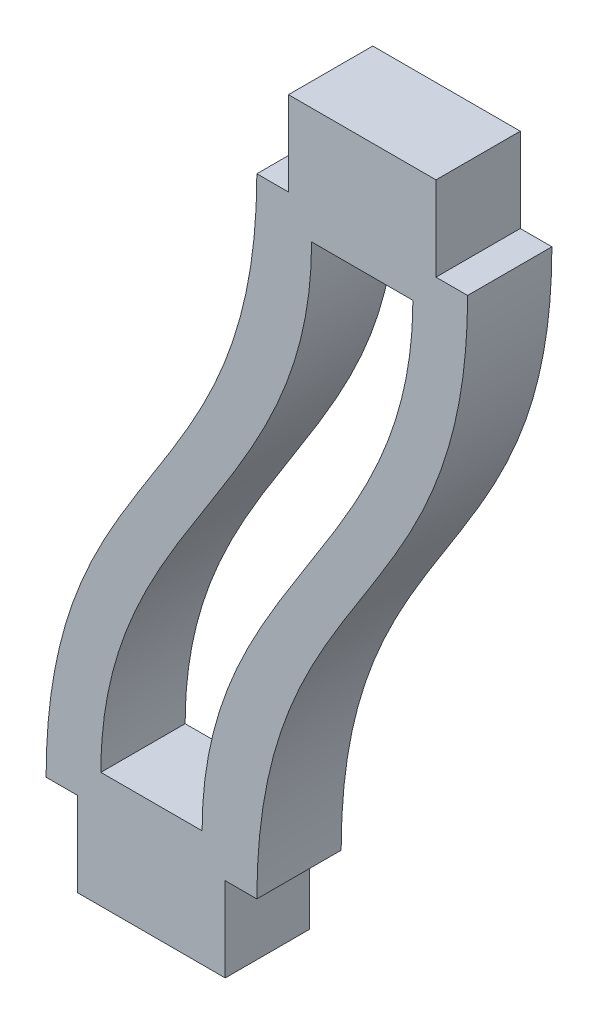
ISO-10303-21;
HEADER;
FILE_DESCRIPTION(('STEP AP214'),'2;1');
FILE_NAME('part.step','',(''),(''),'','','');
FILE_SCHEMA(('AUTOMOTIVE_DESIGN { 1 0 10303 214 1 1 1 1 }'));
ENDSEC;
DATA;
#1=APPLICATION_CONTEXT('core data for automotive mechanical design processes');
#2=APPLICATION_PROTOCOL_DEFINITION('international standard','automotive_design',2000,#1);
#3=PRODUCT_CONTEXT('',#1,'mechanical');
#4=PRODUCT('Part','Part','',(#3));
#5=PRODUCT_RELATED_PRODUCT_CATEGORY('part','',(#4));
#6=PRODUCT_DEFINITION_FORMATION('','',#4);
#7=PRODUCT_DEFINITION_CONTEXT('part definition',#1,'design');
#8=PRODUCT_DEFINITION('design','',#6,#7);
#9=PRODUCT_DEFINITION_SHAPE('','',#8);
#10=(LENGTH_UNIT() NAMED_UNIT(*) SI_UNIT(.MILLI.,.METRE.));
#11=(NAMED_UNIT(*) PLANE_ANGLE_UNIT() SI_UNIT($,.RADIAN.));
#12=(NAMED_UNIT(*) SI_UNIT($,.STERADIAN.) SOLID_ANGLE_UNIT());
#13=UNCERTAINTY_MEASURE_WITH_UNIT(LENGTH_MEASURE(1.E-05),#10,'distance_accuracy_value','');
#14=(GEOMETRIC_REPRESENTATION_CONTEXT(3) GLOBAL_UNCERTAINTY_ASSIGNED_CONTEXT((#13)) GLOBAL_UNIT_ASSIGNED_CONTEXT((#10,
#11,#12)) REPRESENTATION_CONTEXT('',''));
#15=CARTESIAN_POINT('',(0.,0.,0.));
#16=DIRECTION('',(0.,0.,1.));
#17=DIRECTION('',(1.,0.,0.));
#18=AXIS2_PLACEMENT_3D('',#15,#16,#17);
#19=CARTESIAN_POINT('',(0.,0.,4.));
#20=DIRECTION('',(1.,0.,0.));
#21=DIRECTION('',(0.,0.,-1.));
#22=AXIS2_PLACEMENT_3D('',#19,#20,#21);
#23=PLANE('',#22);
#24=DIRECTION('',(0.,-1.,0.));
#25=VECTOR('',#24,1.);
#26=CARTESIAN_POINT('',(0.,0.,0.));
#27=LINE('',#26,#25);
#28=CARTESIAN_POINT('',(0.,4.,0.));
#29=VERTEX_POINT('',#28);
#30=CARTESIAN_POINT('',(0.,0.,0.));
#31=VERTEX_POINT('',#30);
#32=EDGE_CURVE('E162',#29,#31,#27,.T.);
#33=ORIENTED_EDGE('',*,*,#32,.T.);
#34=DIRECTION('',(0.,0.,-1.));
#35=VECTOR('',#34,1.);
#36=CARTESIAN_POINT('',(0.,0.,4.));
#37=LINE('',#36,#35);
#38=CARTESIAN_POINT('',(0.,0.,4.));
#39=VERTEX_POINT('',#38);
#40=EDGE_CURVE('E11',#39,#31,#37,.T.);
#41=ORIENTED_EDGE('',*,*,#40,.F.);
#42=DIRECTION('',(0.,-1.,0.));
#43=VECTOR('',#42,1.);
#44=CARTESIAN_POINT('',(0.,0.,4.));
#45=LINE('',#44,#43);
#46=CARTESIAN_POINT('',(0.,4.,4.));
#47=VERTEX_POINT('',#46);
#48=EDGE_CURVE('E261',#47,#39,#45,.T.);
#49=ORIENTED_EDGE('',*,*,#48,.F.);
#50=DIRECTION('',(0.,0.,-1.));
#51=VECTOR('',#50,1.);
#52=CARTESIAN_POINT('',(0.,4.,4.));
#53=LINE('',#52,#51);
#54=EDGE_CURVE('E226',#47,#29,#53,.T.);
#55=ORIENTED_EDGE('',*,*,#54,.T.);
#56=EDGE_LOOP('',(#33,#41,#49,#55));
#57=FACE_BOUND('',#56,.T.);
#58=ADVANCED_FACE('F36',(#57),#23,.F.);
#59=CARTESIAN_POINT('',(0.,0.,4.));
#60=DIRECTION('',(0.,1.,0.));
#61=DIRECTION('',(0.,0.,1.));
#62=AXIS2_PLACEMENT_3D('',#59,#60,#61);
#63=PLANE('',#62);
#64=DIRECTION('',(1.,0.,0.));
#65=VECTOR('',#64,1.);
#66=CARTESIAN_POINT('',(0.,0.,0.));
#67=LINE('',#66,#65);
#68=CARTESIAN_POINT('',(7.,0.,0.));
#69=VERTEX_POINT('',#68);
#70=EDGE_CURVE('E229',#31,#69,#67,.T.);
#71=ORIENTED_EDGE('',*,*,#70,.T.);
#72=DIRECTION('',(0.,0.,-1.));
#73=VECTOR('',#72,1.);
#74=CARTESIAN_POINT('',(7.,0.,4.));
#75=LINE('',#74,#73);
#76=CARTESIAN_POINT('',(7.,0.,4.));
#77=VERTEX_POINT('',#76);
#78=EDGE_CURVE('E43',#77,#69,#75,.T.);
#79=ORIENTED_EDGE('',*,*,#78,.F.);
#80=DIRECTION('',(1.,0.,0.));
#81=VECTOR('',#80,1.);
#82=CARTESIAN_POINT('',(0.,0.,4.));
#83=LINE('',#82,#81);
#84=EDGE_CURVE('E344',#39,#77,#83,.T.);
#85=ORIENTED_EDGE('',*,*,#84,.F.);
#86=ORIENTED_EDGE('',*,*,#40,.T.);
#87=EDGE_LOOP('',(#71,#79,#85,#86));
#88=FACE_BOUND('',#87,.T.);
#89=ADVANCED_FACE('F337',(#88),#63,.F.);
#90=CARTESIAN_POINT('',(7.,0.,4.));
#91=DIRECTION('',(-1.,0.,0.));
#92=DIRECTION('',(0.,0.,1.));
#93=AXIS2_PLACEMENT_3D('',#90,#91,#92);
#94=PLANE('',#93);
#95=DIRECTION('',(0.,1.,0.));
#96=VECTOR('',#95,1.);
#97=CARTESIAN_POINT('',(7.,0.,0.));
#98=LINE('',#97,#96);
#99=CARTESIAN_POINT('',(7.,4.,0.));
#100=VERTEX_POINT('',#99);
#101=EDGE_CURVE('E231',#69,#100,#98,.T.);
#102=ORIENTED_EDGE('',*,*,#101,.T.);
#103=DIRECTION('',(0.,0.,-1.));
#104=VECTOR('',#103,1.);
#105=CARTESIAN_POINT('',(7.,4.,4.));
#106=LINE('',#105,#104);
#107=CARTESIAN_POINT('',(7.,4.,4.));
#108=VERTEX_POINT('',#107);
#109=EDGE_CURVE('E288',#108,#100,#106,.T.);
#110=ORIENTED_EDGE('',*,*,#109,.F.);
#111=DIRECTION('',(0.,1.,0.));
#112=VECTOR('',#111,1.);
#113=CARTESIAN_POINT('',(7.,0.,4.));
#114=LINE('',#113,#112);
#115=EDGE_CURVE('E297',#77,#108,#114,.T.);
#116=ORIENTED_EDGE('',*,*,#115,.F.);
#117=ORIENTED_EDGE('',*,*,#78,.T.);
#118=EDGE_LOOP('',(#102,#110,#116,#117));
#119=FACE_BOUND('',#118,.T.);
#120=ADVANCED_FACE('F295',(#119),#94,.F.);
#121=CARTESIAN_POINT('',(7.,4.,4.));
#122=DIRECTION('',(0.,1.,0.));
#123=DIRECTION('',(0.,0.,1.));
#124=AXIS2_PLACEMENT_3D('',#121,#122,#123);
#125=PLANE('',#124);
#126=DIRECTION('',(1.,0.,0.));
#127=VECTOR('',#126,1.);
#128=CARTESIAN_POINT('',(7.,4.,0.));
#129=LINE('',#128,#127);
#130=CARTESIAN_POINT('',(8.5,4.,0.));
#131=VERTEX_POINT('',#130);
#132=EDGE_CURVE('E233',#100,#131,#129,.T.);
#133=ORIENTED_EDGE('',*,*,#132,.T.);
#134=DIRECTION('',(0.,0.,-1.));
#135=VECTOR('',#134,1.);
#136=CARTESIAN_POINT('',(8.5,4.,4.));
#137=LINE('',#136,#135);
#138=CARTESIAN_POINT('',(8.5,4.,4.));
#139=VERTEX_POINT('',#138);
#140=EDGE_CURVE('E285',#139,#131,#137,.T.);
#141=ORIENTED_EDGE('',*,*,#140,.F.);
#142=DIRECTION('',(1.,0.,0.));
#143=VECTOR('',#142,1.);
#144=CARTESIAN_POINT('',(7.,4.,4.));
#145=LINE('',#144,#143);
#146=EDGE_CURVE('E315',#108,#139,#145,.T.);
#147=ORIENTED_EDGE('',*,*,#146,.F.);
#148=ORIENTED_EDGE('',*,*,#109,.T.);
#149=EDGE_LOOP('',(#133,#141,#147,#148));
#150=FACE_BOUND('',#149,.T.);
#151=ADVANCED_FACE('F305',(#150),#125,.F.);
#152=CARTESIAN_POINT('',(8.5,4.,4.));
#153=CARTESIAN_POINT('',(8.5,18.0183650964577,4.));
#154=CARTESIAN_POINT('',(18.5,19.7816349035423,4.));
#155=CARTESIAN_POINT('',(18.5,33.8,4.));
#156=B_SPLINE_CURVE_WITH_KNOTS('',3,(#152,#153,#154,#155),.UNSPECIFIED.,.F.,.F.,(4,4),(0.,1.),.UNSPECIFIED.);
#157=DIRECTION('',(0.,0.,-1.));
#158=VECTOR('',#157,1.);
#159=SURFACE_OF_LINEAR_EXTRUSION('',#156,#158);
#160=CARTESIAN_POINT('',(8.5,4.,0.));
#161=CARTESIAN_POINT('',(8.5,18.0183650964577,0.));
#162=CARTESIAN_POINT('',(18.5,19.7816349035423,0.));
#163=CARTESIAN_POINT('',(18.5,33.8,0.));
#164=B_SPLINE_CURVE_WITH_KNOTS('',3,(#160,#161,#162,#163),.UNSPECIFIED.,.F.,.F.,(4,4),(0.,1.),.UNSPECIFIED.);
#165=CARTESIAN_POINT('',(18.5,33.8,0.));
#166=VERTEX_POINT('',#165);
#167=EDGE_CURVE('E235',#131,#166,#164,.T.);
#168=ORIENTED_EDGE('',*,*,#167,.T.);
#169=DIRECTION('',(0.,0.,-1.));
#170=VECTOR('',#169,1.);
#171=CARTESIAN_POINT('',(18.5,33.8,4.));
#172=LINE('',#171,#170);
#173=CARTESIAN_POINT('',(18.5,33.8,4.));
#174=VERTEX_POINT('',#173);
#175=EDGE_CURVE('E282',#174,#166,#172,.T.);
#176=ORIENTED_EDGE('',*,*,#175,.F.);
#177=EDGE_CURVE('E311',#139,#174,#156,.T.);
#178=ORIENTED_EDGE('',*,*,#177,.F.);
#179=ORIENTED_EDGE('',*,*,#140,.T.);
#180=EDGE_LOOP('',(#168,#176,#178,#179));
#181=FACE_BOUND('',#180,.T.);
#182=ADVANCED_FACE('F309',(#181),#159,.F.);
#183=CARTESIAN_POINT('',(17.,33.8,4.));
#184=DIRECTION('',(0.,-1.,0.));
#185=DIRECTION('',(0.,0.,-1.));
#186=AXIS2_PLACEMENT_3D('',#183,#184,#185);
#187=PLANE('',#186);
#188=DIRECTION('',(-1.,0.,0.));
#189=VECTOR('',#188,1.);
#190=CARTESIAN_POINT('',(17.,33.8,0.));
#191=LINE('',#190,#189);
#192=CARTESIAN_POINT('',(17.,33.8,0.));
#193=VERTEX_POINT('',#192);
#194=EDGE_CURVE('E239',#166,#193,#191,.T.);
#195=ORIENTED_EDGE('',*,*,#194,.T.);
#196=DIRECTION('',(0.,0.,-1.));
#197=VECTOR('',#196,1.);
#198=CARTESIAN_POINT('',(17.,33.8,4.));
#199=LINE('',#198,#197);
#200=CARTESIAN_POINT('',(17.,33.8,4.));
#201=VERTEX_POINT('',#200);
#202=EDGE_CURVE('E279',#201,#193,#199,.T.);
#203=ORIENTED_EDGE('',*,*,#202,.F.);
#204=DIRECTION('',(-1.,0.,0.));
#205=VECTOR('',#204,1.);
#206=CARTESIAN_POINT('',(17.,33.8,4.));
#207=LINE('',#206,#205);
#208=EDGE_CURVE('E314',#174,#201,#207,.T.);
#209=ORIENTED_EDGE('',*,*,#208,.F.);
#210=ORIENTED_EDGE('',*,*,#175,.T.);
#211=EDGE_LOOP('',(#195,#203,#209,#210));
#212=FACE_BOUND('',#211,.T.);
#213=ADVANCED_FACE('F332',(#212),#187,.F.);
#214=CARTESIAN_POINT('',(17.,37.8,4.));
#215=DIRECTION('',(-1.,0.,0.));
#216=DIRECTION('',(0.,0.,1.));
#217=AXIS2_PLACEMENT_3D('',#214,#215,#216);
#218=PLANE('',#217);
#219=DIRECTION('',(0.,1.,0.));
#220=VECTOR('',#219,1.);
#221=CARTESIAN_POINT('',(17.,37.8,0.));
#222=LINE('',#221,#220);
#223=CARTESIAN_POINT('',(17.,37.8,0.));
#224=VERTEX_POINT('',#223);
#225=EDGE_CURVE('E244',#193,#224,#222,.T.);
#226=ORIENTED_EDGE('',*,*,#225,.T.);
#227=DIRECTION('',(0.,0.,-1.));
#228=VECTOR('',#227,1.);
#229=CARTESIAN_POINT('',(17.,37.8,4.));
#230=LINE('',#229,#228);
#231=CARTESIAN_POINT('',(17.,37.8,4.));
#232=VERTEX_POINT('',#231);
#233=EDGE_CURVE('E276',#232,#224,#230,.T.);
#234=ORIENTED_EDGE('',*,*,#233,.F.);
#235=DIRECTION('',(0.,1.,0.));
#236=VECTOR('',#235,1.);
#237=CARTESIAN_POINT('',(17.,37.8,4.));
#238=LINE('',#237,#236);
#239=EDGE_CURVE('E317',#201,#232,#238,.T.);
#240=ORIENTED_EDGE('',*,*,#239,.F.);
#241=ORIENTED_EDGE('',*,*,#202,.T.);
#242=EDGE_LOOP('',(#226,#234,#240,#241));
#243=FACE_BOUND('',#242,.T.);
#244=ADVANCED_FACE('F373',(#243),#218,.F.);
#245=CARTESIAN_POINT('',(10.,37.8,4.));
#246=DIRECTION('',(0.,-1.,0.));
#247=DIRECTION('',(0.,0.,-1.));
#248=AXIS2_PLACEMENT_3D('',#245,#246,#247);
#249=PLANE('',#248);
#250=DIRECTION('',(-1.,0.,0.));
#251=VECTOR('',#250,1.);
#252=CARTESIAN_POINT('',(10.,37.8,0.));
#253=LINE('',#252,#251);
#254=CARTESIAN_POINT('',(10.,37.8,0.));
#255=VERTEX_POINT('',#254);
#256=EDGE_CURVE('E246',#224,#255,#253,.T.);
#257=ORIENTED_EDGE('',*,*,#256,.T.);
#258=DIRECTION('',(0.,0.,-1.));
#259=VECTOR('',#258,1.);
#260=CARTESIAN_POINT('',(10.,37.8,4.));
#261=LINE('',#260,#259);
#262=CARTESIAN_POINT('',(10.,37.8,4.));
#263=VERTEX_POINT('',#262);
#264=EDGE_CURVE('E273',#263,#255,#261,.T.);
#265=ORIENTED_EDGE('',*,*,#264,.F.);
#266=DIRECTION('',(-1.,0.,0.));
#267=VECTOR('',#266,1.);
#268=CARTESIAN_POINT('',(10.,37.8,4.));
#269=LINE('',#268,#267);
#270=EDGE_CURVE('E369',#232,#263,#269,.T.);
#271=ORIENTED_EDGE('',*,*,#270,.F.);
#272=ORIENTED_EDGE('',*,*,#233,.T.);
#273=EDGE_LOOP('',(#257,#265,#271,#272));
#274=FACE_BOUND('',#273,.T.);
#275=ADVANCED_FACE('F368',(#274),#249,.F.);
#276=CARTESIAN_POINT('',(10.,33.8,4.));
#277=DIRECTION('',(1.,0.,0.));
#278=DIRECTION('',(0.,0.,-1.));
#279=AXIS2_PLACEMENT_3D('',#276,#277,#278);
#280=PLANE('',#279);
#281=DIRECTION('',(0.,-1.,0.));
#282=VECTOR('',#281,1.);
#283=CARTESIAN_POINT('',(10.,33.8,0.));
#284=LINE('',#283,#282);
#285=CARTESIAN_POINT('',(10.,33.8,0.));
#286=VERTEX_POINT('',#285);
#287=EDGE_CURVE('E248',#255,#286,#284,.T.);
#288=ORIENTED_EDGE('',*,*,#287,.T.);
#289=DIRECTION('',(0.,0.,-1.));
#290=VECTOR('',#289,1.);
#291=CARTESIAN_POINT('',(10.,33.8,4.));
#292=LINE('',#291,#290);
#293=CARTESIAN_POINT('',(10.,33.8,4.));
#294=VERTEX_POINT('',#293);
#295=EDGE_CURVE('E270',#294,#286,#292,.T.);
#296=ORIENTED_EDGE('',*,*,#295,.F.);
#297=DIRECTION('',(0.,-1.,0.));
#298=VECTOR('',#297,1.);
#299=CARTESIAN_POINT('',(10.,33.8,4.));
#300=LINE('',#299,#298);
#301=EDGE_CURVE('E365',#263,#294,#300,.T.);
#302=ORIENTED_EDGE('',*,*,#301,.F.);
#303=ORIENTED_EDGE('',*,*,#264,.T.);
#304=EDGE_LOOP('',(#288,#296,#302,#303));
#305=FACE_BOUND('',#304,.T.);
#306=ADVANCED_FACE('F362',(#305),#280,.F.);
#307=CARTESIAN_POINT('',(8.5,33.8,4.));
#308=DIRECTION('',(0.,-1.,0.));
#309=DIRECTION('',(0.,0.,-1.));
#310=AXIS2_PLACEMENT_3D('',#307,#308,#309);
#311=PLANE('',#310);
#312=DIRECTION('',(-1.,0.,0.));
#313=VECTOR('',#312,1.);
#314=CARTESIAN_POINT('',(8.5,33.8,0.));
#315=LINE('',#314,#313);
#316=CARTESIAN_POINT('',(8.5,33.8,0.));
#317=VERTEX_POINT('',#316);
#318=EDGE_CURVE('E250',#286,#317,#315,.T.);
#319=ORIENTED_EDGE('',*,*,#318,.T.);
#320=DIRECTION('',(0.,0.,-1.));
#321=VECTOR('',#320,1.);
#322=CARTESIAN_POINT('',(8.5,33.8,4.));
#323=LINE('',#322,#321);
#324=CARTESIAN_POINT('',(8.5,33.8,4.));
#325=VERTEX_POINT('',#324);
#326=EDGE_CURVE('E267',#325,#317,#323,.T.);
#327=ORIENTED_EDGE('',*,*,#326,.F.);
#328=DIRECTION('',(-1.,0.,0.));
#329=VECTOR('',#328,1.);
#330=CARTESIAN_POINT('',(8.5,33.8,4.));
#331=LINE('',#330,#329);
#332=EDGE_CURVE('E220',#294,#325,#331,.T.);
#333=ORIENTED_EDGE('',*,*,#332,.F.);
#334=ORIENTED_EDGE('',*,*,#295,.T.);
#335=EDGE_LOOP('',(#319,#327,#333,#334));
#336=FACE_BOUND('',#335,.T.);
#337=ADVANCED_FACE('F210',(#336),#311,.F.);
#338=CARTESIAN_POINT('',(8.5,33.8,4.));
#339=CARTESIAN_POINT('',(8.5,19.7816349035423,4.));
#340=CARTESIAN_POINT('',(-1.5,18.0183650964577,4.));
#341=CARTESIAN_POINT('',(-1.5,4.,4.));
#342=B_SPLINE_CURVE_WITH_KNOTS('',3,(#338,#339,#340,#341),.UNSPECIFIED.,.F.,.F.,(4,4),(0.,1.),.UNSPECIFIED.);
#343=DIRECTION('',(0.,0.,-1.));
#344=VECTOR('',#343,1.);
#345=SURFACE_OF_LINEAR_EXTRUSION('',#342,#344);
#346=CARTESIAN_POINT('',(8.5,33.8,0.));
#347=CARTESIAN_POINT('',(8.5,19.7816349035423,0.));
#348=CARTESIAN_POINT('',(-1.5,18.0183650964577,0.));
#349=CARTESIAN_POINT('',(-1.5,4.,0.));
#350=B_SPLINE_CURVE_WITH_KNOTS('',3,(#346,#347,#348,#349),.UNSPECIFIED.,.F.,.F.,(4,4),(0.,1.),.UNSPECIFIED.);
#351=CARTESIAN_POINT('',(-1.5,4.,0.));
#352=VERTEX_POINT('',#351);
#353=EDGE_CURVE('E252',#317,#352,#350,.T.);
#354=ORIENTED_EDGE('',*,*,#353,.T.);
#355=DIRECTION('',(0.,0.,-1.));
#356=VECTOR('',#355,1.);
#357=CARTESIAN_POINT('',(-1.5,4.,4.));
#358=LINE('',#357,#356);
#359=CARTESIAN_POINT('',(-1.5,4.,4.));
#360=VERTEX_POINT('',#359);
#361=EDGE_CURVE('E264',#360,#352,#358,.T.);
#362=ORIENTED_EDGE('',*,*,#361,.F.);
#363=EDGE_CURVE('E213',#325,#360,#342,.T.);
#364=ORIENTED_EDGE('',*,*,#363,.F.);
#365=ORIENTED_EDGE('',*,*,#326,.T.);
#366=EDGE_LOOP('',(#354,#362,#364,#365));
#367=FACE_BOUND('',#366,.T.);
#368=ADVANCED_FACE('F205',(#367),#345,.F.);
#369=CARTESIAN_POINT('',(0.,4.,4.));
#370=DIRECTION('',(0.,1.,0.));
#371=DIRECTION('',(0.,0.,1.));
#372=AXIS2_PLACEMENT_3D('',#369,#370,#371);
#373=PLANE('',#372);
#374=DIRECTION('',(1.,0.,0.));
#375=VECTOR('',#374,1.);
#376=CARTESIAN_POINT('',(0.,4.,0.));
#377=LINE('',#376,#375);
#378=EDGE_CURVE('E256',#352,#29,#377,.T.);
#379=ORIENTED_EDGE('',*,*,#378,.T.);
#380=ORIENTED_EDGE('',*,*,#54,.F.);
#381=DIRECTION('',(1.,0.,0.));
#382=VECTOR('',#381,1.);
#383=CARTESIAN_POINT('',(0.,4.,4.));
#384=LINE('',#383,#382);
#385=EDGE_CURVE('E219',#360,#47,#384,.T.);
#386=ORIENTED_EDGE('',*,*,#385,.F.);
#387=ORIENTED_EDGE('',*,*,#361,.T.);
#388=EDGE_LOOP('',(#379,#380,#386,#387));
#389=FACE_BOUND('',#388,.T.);
#390=ADVANCED_FACE('F199',(#389),#373,.F.);
#391=CARTESIAN_POINT('',(3.5,18.9,4.));
#392=DIRECTION('',(0.,0.,1.));
#393=DIRECTION('',(1.,0.,0.));
#394=AXIS2_PLACEMENT_3D('',#391,#392,#393);
#395=PLANE('',#394);
#396=CARTESIAN_POINT('',(11.0980762113533,32.3,4.));
#397=CARTESIAN_POINT('',(11.0980762113533,21.231538290775,4.));
#398=CARTESIAN_POINT('',(1.09807621135331,16.568461709225,4.));
#399=CARTESIAN_POINT('',(1.09807621135331,5.5,4.));
#400=B_SPLINE_CURVE_WITH_KNOTS('',3,(#396,#397,#398,#399),.UNSPECIFIED.,.F.,.F.,(4,4),(0.,1.),.UNSPECIFIED.);
#401=CARTESIAN_POINT('',(11.0980762113533,32.3,4.));
#402=VERTEX_POINT('',#401);
#403=CARTESIAN_POINT('',(1.09807621135331,5.5,4.));
#404=VERTEX_POINT('',#403);
#405=EDGE_CURVE('E50',#402,#404,#400,.T.);
#406=ORIENTED_EDGE('',*,*,#405,.F.);
#407=DIRECTION('',(-1.,0.,0.));
#408=VECTOR('',#407,1.);
#409=CARTESIAN_POINT('',(11.0980762113533,32.3,4.));
#410=LINE('',#409,#408);
#411=CARTESIAN_POINT('',(15.9019237886467,32.3,4.));
#412=VERTEX_POINT('',#411);
#413=EDGE_CURVE('E156',#412,#402,#410,.T.);
#414=ORIENTED_EDGE('',*,*,#413,.F.);
#415=CARTESIAN_POINT('',(5.90192378864668,5.5,4.));
#416=CARTESIAN_POINT('',(5.90192378864668,16.568461709225,4.));
#417=CARTESIAN_POINT('',(15.9019237886467,21.231538290775,4.));
#418=CARTESIAN_POINT('',(15.9019237886467,32.3,4.));
#419=B_SPLINE_CURVE_WITH_KNOTS('',3,(#415,#416,#417,#418),.UNSPECIFIED.,.F.,.F.,(4,4),(0.,1.),.UNSPECIFIED.);
#420=CARTESIAN_POINT('',(5.90192378864668,5.5,4.));
#421=VERTEX_POINT('',#420);
#422=EDGE_CURVE('E386',#421,#412,#419,.T.);
#423=ORIENTED_EDGE('',*,*,#422,.F.);
#424=DIRECTION('',(1.,0.,0.));
#425=VECTOR('',#424,1.);
#426=CARTESIAN_POINT('',(1.09807621135331,5.5,4.));
#427=LINE('',#426,#425);
#428=EDGE_CURVE('E170',#404,#421,#427,.T.);
#429=ORIENTED_EDGE('',*,*,#428,.F.);
#430=EDGE_LOOP('',(#406,#414,#423,#429));
#431=FACE_BOUND('',#430,.T.);
#432=ORIENTED_EDGE('',*,*,#48,.T.);
#433=ORIENTED_EDGE('',*,*,#84,.T.);
#434=ORIENTED_EDGE('',*,*,#115,.T.);
#435=ORIENTED_EDGE('',*,*,#146,.T.);
#436=ORIENTED_EDGE('',*,*,#177,.T.);
#437=ORIENTED_EDGE('',*,*,#208,.T.);
#438=ORIENTED_EDGE('',*,*,#239,.T.);
#439=ORIENTED_EDGE('',*,*,#270,.T.);
#440=ORIENTED_EDGE('',*,*,#301,.T.);
#441=ORIENTED_EDGE('',*,*,#332,.T.);
#442=ORIENTED_EDGE('',*,*,#363,.T.);
#443=ORIENTED_EDGE('',*,*,#385,.T.);
#444=EDGE_LOOP('',(#432,#433,#434,#435,#436,#437,#438,#439,#440,#441,#442,#443));
#445=FACE_BOUND('',#444,.T.);
#446=ADVANCED_FACE('F196',(#431,#445),#395,.T.);
#447=CARTESIAN_POINT('',(3.5,18.9,0.));
#448=DIRECTION('',(0.,0.,1.));
#449=DIRECTION('',(1.,0.,0.));
#450=AXIS2_PLACEMENT_3D('',#447,#448,#449);
#451=PLANE('',#450);
#452=DIRECTION('',(1.,0.,0.));
#453=VECTOR('',#452,1.);
#454=CARTESIAN_POINT('',(11.0980762113533,32.3,0.));
#455=LINE('',#454,#453);
#456=CARTESIAN_POINT('',(11.0980762113533,32.3,0.));
#457=VERTEX_POINT('',#456);
#458=CARTESIAN_POINT('',(15.9019237886467,32.3,0.));
#459=VERTEX_POINT('',#458);
#460=EDGE_CURVE('E168',#457,#459,#455,.T.);
#461=ORIENTED_EDGE('',*,*,#460,.F.);
#462=CARTESIAN_POINT('',(11.0980762113533,32.3,0.));
#463=CARTESIAN_POINT('',(11.0980762113533,21.231538290775,0.));
#464=CARTESIAN_POINT('',(1.09807621135331,16.568461709225,0.));
#465=CARTESIAN_POINT('',(1.09807621135331,5.5,0.));
#466=B_SPLINE_CURVE_WITH_KNOTS('',3,(#462,#463,#464,#465),.UNSPECIFIED.,.F.,.F.,(4,4),(0.,1.),.UNSPECIFIED.);
#467=CARTESIAN_POINT('',(1.09807621135331,5.5,0.));
#468=VERTEX_POINT('',#467);
#469=EDGE_CURVE('E150',#468,#457,#466,.F.);
#470=ORIENTED_EDGE('',*,*,#469,.F.);
#471=DIRECTION('',(-1.,0.,0.));
#472=VECTOR('',#471,1.);
#473=CARTESIAN_POINT('',(1.09807621135331,5.5,0.));
#474=LINE('',#473,#472);
#475=CARTESIAN_POINT('',(5.90192378864668,5.5,0.));
#476=VERTEX_POINT('',#475);
#477=EDGE_CURVE('E159',#476,#468,#474,.T.);
#478=ORIENTED_EDGE('',*,*,#477,.F.);
#479=CARTESIAN_POINT('',(5.90192378864668,5.5,0.));
#480=CARTESIAN_POINT('',(5.90192378864668,16.568461709225,0.));
#481=CARTESIAN_POINT('',(15.9019237886467,21.231538290775,0.));
#482=CARTESIAN_POINT('',(15.9019237886467,32.3,0.));
#483=B_SPLINE_CURVE_WITH_KNOTS('',3,(#479,#480,#481,#482),.UNSPECIFIED.,.F.,.F.,(4,4),(0.,1.),.UNSPECIFIED.);
#484=EDGE_CURVE('E58',#459,#476,#483,.F.);
#485=ORIENTED_EDGE('',*,*,#484,.F.);
#486=EDGE_LOOP('',(#461,#470,#478,#485));
#487=FACE_BOUND('',#486,.T.);
#488=ORIENTED_EDGE('',*,*,#32,.F.);
#489=ORIENTED_EDGE('',*,*,#378,.F.);
#490=ORIENTED_EDGE('',*,*,#353,.F.);
#491=ORIENTED_EDGE('',*,*,#318,.F.);
#492=ORIENTED_EDGE('',*,*,#287,.F.);
#493=ORIENTED_EDGE('',*,*,#256,.F.);
#494=ORIENTED_EDGE('',*,*,#225,.F.);
#495=ORIENTED_EDGE('',*,*,#194,.F.);
#496=ORIENTED_EDGE('',*,*,#167,.F.);
#497=ORIENTED_EDGE('',*,*,#132,.F.);
#498=ORIENTED_EDGE('',*,*,#101,.F.);
#499=ORIENTED_EDGE('',*,*,#70,.F.);
#500=EDGE_LOOP('',(#488,#489,#490,#491,#492,#493,#494,#495,#496,#497,#498,#499));
#501=FACE_BOUND('',#500,.T.);
#502=ADVANCED_FACE('F165',(#487,#501),#451,.F.);
#503=CARTESIAN_POINT('',(11.0980762113533,32.3,-0.00100000000000013));
#504=CARTESIAN_POINT('',(11.0980762113533,21.231538290775,-0.00100000000000013));
#505=CARTESIAN_POINT('',(1.09807621135331,16.568461709225,-0.00100000000000013));
#506=CARTESIAN_POINT('',(1.09807621135331,5.5,-0.00100000000000013));
#507=B_SPLINE_CURVE_WITH_KNOTS('',3,(#503,#504,#505,#506),.UNSPECIFIED.,.F.,.F.,(4,4),(0.,1.),.UNSPECIFIED.);
#508=DIRECTION('',(0.,0.,1.));
#509=VECTOR('',#508,1.);
#510=SURFACE_OF_LINEAR_EXTRUSION('',#507,#509);
#511=ORIENTED_EDGE('',*,*,#469,.T.);
#512=DIRECTION('',(0.,0.,1.));
#513=VECTOR('',#512,1.);
#514=CARTESIAN_POINT('',(11.0980762113533,32.3,-0.00100000000000013));
#515=LINE('',#514,#513);
#516=EDGE_CURVE('E163',#457,#402,#515,.T.);
#517=ORIENTED_EDGE('',*,*,#516,.T.);
#518=ORIENTED_EDGE('',*,*,#405,.T.);
#519=DIRECTION('',(0.,0.,1.));
#520=VECTOR('',#519,1.);
#521=CARTESIAN_POINT('',(1.09807621135331,5.5,-0.00100000000000013));
#522=LINE('',#521,#520);
#523=EDGE_CURVE('E146',#468,#404,#522,.T.);
#524=ORIENTED_EDGE('',*,*,#523,.F.);
#525=EDGE_LOOP('',(#511,#517,#518,#524));
#526=FACE_BOUND('',#525,.T.);
#527=ADVANCED_FACE('F148',(#526),#510,.F.);
#528=CARTESIAN_POINT('',(11.0980762113533,32.3,-0.00100000000000013));
#529=DIRECTION('',(0.,1.,0.));
#530=DIRECTION('',(0.,0.,1.));
#531=AXIS2_PLACEMENT_3D('',#528,#529,#530);
#532=PLANE('',#531);
#533=ORIENTED_EDGE('',*,*,#460,.T.);
#534=DIRECTION('',(0.,0.,1.));
#535=VECTOR('',#534,1.);
#536=CARTESIAN_POINT('',(15.9019237886467,32.3,-0.00100000000000013));
#537=LINE('',#536,#535);
#538=EDGE_CURVE('E381',#459,#412,#537,.T.);
#539=ORIENTED_EDGE('',*,*,#538,.T.);
#540=ORIENTED_EDGE('',*,*,#413,.T.);
#541=ORIENTED_EDGE('',*,*,#516,.F.);
#542=EDGE_LOOP('',(#533,#539,#540,#541));
#543=FACE_BOUND('',#542,.T.);
#544=ADVANCED_FACE('F194',(#543),#532,.F.);
#545=CARTESIAN_POINT('',(5.90192378864668,5.5,-0.00100000000000013));
#546=CARTESIAN_POINT('',(5.90192378864668,16.568461709225,-0.00100000000000013));
#547=CARTESIAN_POINT('',(15.9019237886467,21.231538290775,-0.00100000000000013));
#548=CARTESIAN_POINT('',(15.9019237886467,32.3,-0.00100000000000013));
#549=B_SPLINE_CURVE_WITH_KNOTS('',3,(#545,#546,#547,#548),.UNSPECIFIED.,.F.,.F.,(4,4),(0.,1.),.UNSPECIFIED.);
#550=DIRECTION('',(0.,0.,1.));
#551=VECTOR('',#550,1.);
#552=SURFACE_OF_LINEAR_EXTRUSION('',#549,#551);
#553=ORIENTED_EDGE('',*,*,#484,.T.);
#554=DIRECTION('',(0.,0.,1.));
#555=VECTOR('',#554,1.);
#556=CARTESIAN_POINT('',(5.90192378864668,5.5,-0.00100000000000013));
#557=LINE('',#556,#555);
#558=EDGE_CURVE('E155',#476,#421,#557,.T.);
#559=ORIENTED_EDGE('',*,*,#558,.T.);
#560=ORIENTED_EDGE('',*,*,#422,.T.);
#561=ORIENTED_EDGE('',*,*,#538,.F.);
#562=EDGE_LOOP('',(#553,#559,#560,#561));
#563=FACE_BOUND('',#562,.T.);
#564=ADVANCED_FACE('F401',(#563),#552,.F.);
#565=CARTESIAN_POINT('',(1.09807621135331,5.5,-0.00100000000000013));
#566=DIRECTION('',(0.,-1.,0.));
#567=DIRECTION('',(0.,0.,-1.));
#568=AXIS2_PLACEMENT_3D('',#565,#566,#567);
#569=PLANE('',#568);
#570=ORIENTED_EDGE('',*,*,#477,.T.);
#571=ORIENTED_EDGE('',*,*,#523,.T.);
#572=ORIENTED_EDGE('',*,*,#428,.T.);
#573=ORIENTED_EDGE('',*,*,#558,.F.);
#574=EDGE_LOOP('',(#570,#571,#572,#573));
#575=FACE_BOUND('',#574,.T.);
#576=ADVANCED_FACE('F160',(#575),#569,.F.);
#577=CLOSED_SHELL('',(#58,#89,#120,#151,#182,#213,#244,#275,#306,#337,#368,#390,#446,#502,#527,
#544,#564,#576));
#578=MANIFOLD_SOLID_BREP('B2',#577);
#579=ADVANCED_BREP_SHAPE_REPRESENTATION('',(#18,#578),#14);
#580=SHAPE_DEFINITION_REPRESENTATION(#9,#579);
ENDSEC;
END-ISO-10303-21;
